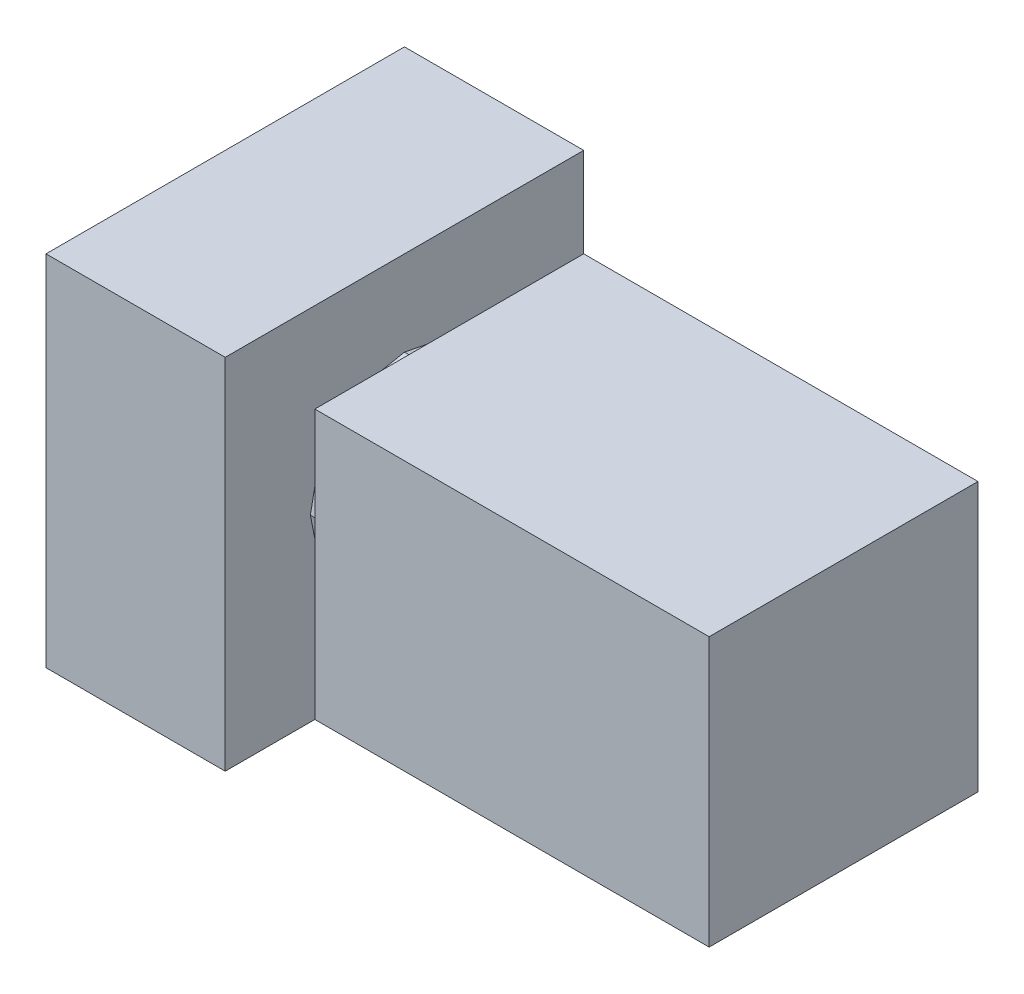
ISO-10303-21;
HEADER;
FILE_DESCRIPTION(('STEP AP214'),'2;1');
FILE_NAME('part.step','',(''),(''),'','','');
FILE_SCHEMA(('AUTOMOTIVE_DESIGN { 1 0 10303 214 1 1 1 1 }'));
ENDSEC;
DATA;
#1=APPLICATION_CONTEXT('core data for automotive mechanical design processes');
#2=APPLICATION_PROTOCOL_DEFINITION('international standard','automotive_design',2000,#1);
#3=PRODUCT_CONTEXT('',#1,'mechanical');
#4=PRODUCT('Part','Part','',(#3));
#5=PRODUCT_RELATED_PRODUCT_CATEGORY('part','',(#4));
#6=PRODUCT_DEFINITION_FORMATION('','',#4);
#7=PRODUCT_DEFINITION_CONTEXT('part definition',#1,'design');
#8=PRODUCT_DEFINITION('design','',#6,#7);
#9=PRODUCT_DEFINITION_SHAPE('','',#8);
#10=(LENGTH_UNIT() NAMED_UNIT(*) SI_UNIT(.MILLI.,.METRE.));
#11=(NAMED_UNIT(*) PLANE_ANGLE_UNIT() SI_UNIT($,.RADIAN.));
#12=(NAMED_UNIT(*) SI_UNIT($,.STERADIAN.) SOLID_ANGLE_UNIT());
#13=UNCERTAINTY_MEASURE_WITH_UNIT(LENGTH_MEASURE(1.E-05),#10,'distance_accuracy_value','');
#14=(GEOMETRIC_REPRESENTATION_CONTEXT(3) GLOBAL_UNCERTAINTY_ASSIGNED_CONTEXT((#13)) GLOBAL_UNIT_ASSIGNED_CONTEXT((#10,
#11,#12)) REPRESENTATION_CONTEXT('',''));
#15=CARTESIAN_POINT('',(0.,0.,0.));
#16=DIRECTION('',(0.,0.,1.));
#17=DIRECTION('',(1.,0.,0.));
#18=AXIS2_PLACEMENT_3D('',#15,#16,#17);
#19=CARTESIAN_POINT('',(-68.5,10.5,235.));
#20=DIRECTION('',(0.,-0.980785280403231,-0.195090322016128));
#21=DIRECTION('',(0.,0.195090322016128,-0.980785280403231));
#22=AXIS2_PLACEMENT_3D('',#19,#20,#21);
#23=PLANE('',#22);
#24=DIRECTION('',(0.,-0.195090322016128,0.980785280403231));
#25=VECTOR('',#24,1.);
#26=CARTESIAN_POINT('',(-69.,10.5,235.));
#27=LINE('',#26,#25);
#28=CARTESIAN_POINT('',(-69.,10.5,235.));
#29=VERTEX_POINT('',#28);
#30=CARTESIAN_POINT('',(-69.,9.70073509136851,239.018176039833));
#31=VERTEX_POINT('',#30);
#32=EDGE_CURVE('E269',#29,#31,#27,.T.);
#33=ORIENTED_EDGE('',*,*,#32,.F.);
#34=DIRECTION('',(-1.,0.,0.));
#35=VECTOR('',#34,1.);
#36=CARTESIAN_POINT('',(-68.5,10.5,235.));
#37=LINE('',#36,#35);
#38=CARTESIAN_POINT('',(-74.,10.5,235.));
#39=VERTEX_POINT('',#38);
#40=EDGE_CURVE('E272',#29,#39,#37,.T.);
#41=ORIENTED_EDGE('',*,*,#40,.T.);
#42=DIRECTION('',(0.,-0.195090322016128,0.980785280403231));
#43=VECTOR('',#42,1.);
#44=CARTESIAN_POINT('',(-74.,5.51232854714624,260.07471766868));
#45=LINE('',#44,#43);
#46=CARTESIAN_POINT('',(-74.,9.70073509136851,239.018176039833));
#47=VERTEX_POINT('',#46);
#48=EDGE_CURVE('E50',#39,#47,#45,.T.);
#49=ORIENTED_EDGE('',*,*,#48,.T.);
#50=DIRECTION('',(-1.,0.,0.));
#51=VECTOR('',#50,1.);
#52=CARTESIAN_POINT('',(-68.5,9.70073509136851,239.018176039833));
#53=LINE('',#52,#51);
#54=EDGE_CURVE('E303',#31,#47,#53,.T.);
#55=ORIENTED_EDGE('',*,*,#54,.F.);
#56=EDGE_LOOP('',(#33,#41,#49,#55));
#57=FACE_BOUND('',#56,.T.);
#58=ADVANCED_FACE('F39',(#57),#23,.F.);
#59=CARTESIAN_POINT('',(-68.5,9.70073509136851,239.018176039833));
#60=DIRECTION('',(0.,-0.831469612302543,-0.555570233019605));
#61=DIRECTION('',(0.,0.555570233019605,-0.831469612302544));
#62=AXIS2_PLACEMENT_3D('',#59,#60,#61);
#63=PLANE('',#62);
#64=DIRECTION('',(0.,-0.555570233019605,0.831469612302544));
#65=VECTOR('',#64,1.);
#66=CARTESIAN_POINT('',(-69.,9.70073509136851,239.018176039833));
#67=LINE('',#66,#65);
#68=CARTESIAN_POINT('',(-69.,7.42462120245875,242.424621202459));
#69=VERTEX_POINT('',#68);
#70=EDGE_CURVE('E53',#31,#69,#67,.T.);
#71=ORIENTED_EDGE('',*,*,#70,.F.);
#72=ORIENTED_EDGE('',*,*,#54,.T.);
#73=DIRECTION('',(0.,-0.555570233019605,0.831469612302544));
#74=VECTOR('',#73,1.);
#75=CARTESIAN_POINT('',(-74.,-6.84928285454845,263.78702826991));
#76=LINE('',#75,#74);
#77=CARTESIAN_POINT('',(-74.,7.42462120245875,242.424621202459));
#78=VERTEX_POINT('',#77);
#79=EDGE_CURVE('E380',#47,#78,#76,.T.);
#80=ORIENTED_EDGE('',*,*,#79,.T.);
#81=DIRECTION('',(-1.,0.,0.));
#82=VECTOR('',#81,1.);
#83=CARTESIAN_POINT('',(-68.5,7.42462120245875,242.424621202459));
#84=LINE('',#83,#82);
#85=EDGE_CURVE('E302',#69,#78,#84,.T.);
#86=ORIENTED_EDGE('',*,*,#85,.F.);
#87=EDGE_LOOP('',(#71,#72,#80,#86));
#88=FACE_BOUND('',#87,.T.);
#89=ADVANCED_FACE('F438',(#88),#63,.F.);
#90=CARTESIAN_POINT('',(-68.5,7.42462120245875,242.424621202459));
#91=DIRECTION('',(0.,-0.555570233019605,-0.831469612302544));
#92=DIRECTION('',(0.,0.831469612302544,-0.555570233019605));
#93=AXIS2_PLACEMENT_3D('',#90,#91,#92);
#94=PLANE('',#93);
#95=DIRECTION('',(0.,-0.831469612302544,0.555570233019605));
#96=VECTOR('',#95,1.);
#97=CARTESIAN_POINT('',(-69.,7.42462120245875,242.424621202459));
#98=LINE('',#97,#96);
#99=CARTESIAN_POINT('',(-69.,4.01817603983344,244.700735091369));
#100=VERTEX_POINT('',#99);
#101=EDGE_CURVE('E65',#69,#100,#98,.T.);
#102=ORIENTED_EDGE('',*,*,#101,.F.);
#103=ORIENTED_EDGE('',*,*,#85,.T.);
#104=DIRECTION('',(0.,-0.831469612302544,0.555570233019605));
#105=VECTOR('',#104,1.);
#106=CARTESIAN_POINT('',(-74.,-17.3442310276176,258.974639148376));
#107=LINE('',#106,#105);
#108=CARTESIAN_POINT('',(-74.,4.01817603983344,244.700735091369));
#109=VERTEX_POINT('',#108);
#110=EDGE_CURVE('E372',#78,#109,#107,.T.);
#111=ORIENTED_EDGE('',*,*,#110,.T.);
#112=DIRECTION('',(-1.,0.,0.));
#113=VECTOR('',#112,1.);
#114=CARTESIAN_POINT('',(-68.5,4.01817603983344,244.700735091369));
#115=LINE('',#114,#113);
#116=EDGE_CURVE('E296',#100,#109,#115,.T.);
#117=ORIENTED_EDGE('',*,*,#116,.F.);
#118=EDGE_LOOP('',(#102,#103,#111,#117));
#119=FACE_BOUND('',#118,.T.);
#120=ADVANCED_FACE('F437',(#119),#94,.F.);
#121=CARTESIAN_POINT('',(-68.5,4.01817603983344,244.700735091369));
#122=DIRECTION('',(0.,-0.19509032201613,-0.98078528040323));
#123=DIRECTION('',(0.,0.98078528040323,-0.19509032201613));
#124=AXIS2_PLACEMENT_3D('',#121,#122,#123);
#125=PLANE('',#124);
#126=DIRECTION('',(0.,-0.98078528040323,0.19509032201613));
#127=VECTOR('',#126,1.);
#128=CARTESIAN_POINT('',(-69.,4.01817603983344,244.700735091369));
#129=LINE('',#128,#127);
#130=CARTESIAN_POINT('',(-69.,0.,245.5));
#131=VERTEX_POINT('',#130);
#132=EDGE_CURVE('E264',#100,#131,#129,.T.);
#133=ORIENTED_EDGE('',*,*,#132,.F.);
#134=ORIENTED_EDGE('',*,*,#116,.T.);
#135=DIRECTION('',(0.,-0.98078528040323,0.19509032201613));
#136=VECTOR('',#135,1.);
#137=CARTESIAN_POINT('',(-74.,-21.0565416288471,249.688406544222));
#138=LINE('',#137,#136);
#139=CARTESIAN_POINT('',(-74.,0.,245.5));
#140=VERTEX_POINT('',#139);
#141=EDGE_CURVE('E371',#109,#140,#138,.T.);
#142=ORIENTED_EDGE('',*,*,#141,.T.);
#143=DIRECTION('',(-1.,0.,0.));
#144=VECTOR('',#143,1.);
#145=CARTESIAN_POINT('',(-68.5,0.,245.5));
#146=LINE('',#145,#144);
#147=EDGE_CURVE('E300',#131,#140,#146,.T.);
#148=ORIENTED_EDGE('',*,*,#147,.F.);
#149=EDGE_LOOP('',(#133,#134,#142,#148));
#150=FACE_BOUND('',#149,.T.);
#151=ADVANCED_FACE('F440',(#150),#125,.F.);
#152=CARTESIAN_POINT('',(-68.5,0.,245.5));
#153=DIRECTION('',(0.,0.19509032201613,-0.98078528040323));
#154=DIRECTION('',(0.,0.98078528040323,0.19509032201613));
#155=AXIS2_PLACEMENT_3D('',#152,#153,#154);
#156=PLANE('',#155);
#157=DIRECTION('',(0.,-0.98078528040323,-0.19509032201613));
#158=VECTOR('',#157,1.);
#159=CARTESIAN_POINT('',(-69.,0.,245.5));
#160=LINE('',#159,#158);
#161=CARTESIAN_POINT('',(-69.,-4.01817603983344,244.700735091369));
#162=VERTEX_POINT('',#161);
#163=EDGE_CURVE('E265',#131,#162,#160,.T.);
#164=ORIENTED_EDGE('',*,*,#163,.F.);
#165=ORIENTED_EDGE('',*,*,#147,.T.);
#166=DIRECTION('',(0.,-0.98078528040323,-0.19509032201613));
#167=VECTOR('',#166,1.);
#168=CARTESIAN_POINT('',(-74.,-17.4210490213787,242.03473789692));
#169=LINE('',#168,#167);
#170=CARTESIAN_POINT('',(-74.,-4.01817603983344,244.700735091369));
#171=VERTEX_POINT('',#170);
#172=EDGE_CURVE('E366',#140,#171,#169,.T.);
#173=ORIENTED_EDGE('',*,*,#172,.T.);
#174=DIRECTION('',(-1.,0.,0.));
#175=VECTOR('',#174,1.);
#176=CARTESIAN_POINT('',(-68.5,-4.01817603983344,244.700735091369));
#177=LINE('',#176,#175);
#178=EDGE_CURVE('E293',#162,#171,#177,.T.);
#179=ORIENTED_EDGE('',*,*,#178,.F.);
#180=EDGE_LOOP('',(#164,#165,#173,#179));
#181=FACE_BOUND('',#180,.T.);
#182=ADVANCED_FACE('F435',(#181),#156,.F.);
#183=CARTESIAN_POINT('',(-68.5,-4.01817603983344,244.700735091369));
#184=DIRECTION('',(0.,0.555570233019605,-0.831469612302544));
#185=DIRECTION('',(0.,0.831469612302544,0.555570233019605));
#186=AXIS2_PLACEMENT_3D('',#183,#184,#185);
#187=PLANE('',#186);
#188=DIRECTION('',(0.,-0.831469612302544,-0.555570233019605));
#189=VECTOR('',#188,1.);
#190=CARTESIAN_POINT('',(-69.,-4.01817603983344,244.700735091369));
#191=LINE('',#190,#189);
#192=CARTESIAN_POINT('',(-69.,-7.42462120245875,242.424621202459));
#193=VERTEX_POINT('',#192);
#194=EDGE_CURVE('E259',#162,#193,#191,.T.);
#195=ORIENTED_EDGE('',*,*,#194,.F.);
#196=ORIENTED_EDGE('',*,*,#178,.T.);
#197=DIRECTION('',(0.,-0.831469612302544,-0.555570233019605));
#198=VECTOR('',#197,1.);
#199=CARTESIAN_POINT('',(-74.,-10.3094376196841,240.49704849815));
#200=LINE('',#199,#198);
#201=CARTESIAN_POINT('',(-74.,-7.42462120245875,242.424621202459));
#202=VERTEX_POINT('',#201);
#203=EDGE_CURVE('E364',#171,#202,#200,.T.);
#204=ORIENTED_EDGE('',*,*,#203,.T.);
#205=DIRECTION('',(-1.,0.,0.));
#206=VECTOR('',#205,1.);
#207=CARTESIAN_POINT('',(-68.5,-7.42462120245875,242.424621202459));
#208=LINE('',#207,#206);
#209=EDGE_CURVE('E291',#193,#202,#208,.T.);
#210=ORIENTED_EDGE('',*,*,#209,.F.);
#211=EDGE_LOOP('',(#195,#196,#204,#210));
#212=FACE_BOUND('',#211,.T.);
#213=ADVANCED_FACE('F427',(#212),#187,.F.);
#214=CARTESIAN_POINT('',(-68.5,-7.42462120245875,242.424621202459));
#215=DIRECTION('',(0.,0.831469612302543,-0.555570233019605));
#216=DIRECTION('',(0.,0.555570233019605,0.831469612302543));
#217=AXIS2_PLACEMENT_3D('',#214,#215,#216);
#218=PLANE('',#217);
#219=DIRECTION('',(0.,-0.555570233019605,-0.831469612302543));
#220=VECTOR('',#219,1.);
#221=CARTESIAN_POINT('',(-69.,-7.42462120245875,242.424621202459));
#222=LINE('',#221,#220);
#223=CARTESIAN_POINT('',(-69.,-9.70073509136851,239.018176039833));
#224=VERTEX_POINT('',#223);
#225=EDGE_CURVE('E258',#193,#224,#222,.T.);
#226=ORIENTED_EDGE('',*,*,#225,.F.);
#227=ORIENTED_EDGE('',*,*,#209,.T.);
#228=DIRECTION('',(0.,-0.555570233019605,-0.831469612302543));
#229=VECTOR('',#228,1.);
#230=CARTESIAN_POINT('',(-74.,-5.49704849814987,245.309437619684));
#231=LINE('',#230,#229);
#232=CARTESIAN_POINT('',(-74.,-9.70073509136851,239.018176039833));
#233=VERTEX_POINT('',#232);
#234=EDGE_CURVE('E362',#202,#233,#231,.T.);
#235=ORIENTED_EDGE('',*,*,#234,.T.);
#236=DIRECTION('',(-1.,0.,0.));
#237=VECTOR('',#236,1.);
#238=CARTESIAN_POINT('',(-68.5,-9.70073509136851,239.018176039833));
#239=LINE('',#238,#237);
#240=EDGE_CURVE('E292',#224,#233,#239,.T.);
#241=ORIENTED_EDGE('',*,*,#240,.F.);
#242=EDGE_LOOP('',(#226,#227,#235,#241));
#243=FACE_BOUND('',#242,.T.);
#244=ADVANCED_FACE('F422',(#243),#218,.F.);
#245=CARTESIAN_POINT('',(-68.5,-9.70073509136851,239.018176039833));
#246=DIRECTION('',(0.,0.980785280403231,-0.195090322016128));
#247=DIRECTION('',(0.,0.195090322016128,0.980785280403231));
#248=AXIS2_PLACEMENT_3D('',#245,#246,#247);
#249=PLANE('',#248);
#250=DIRECTION('',(0.,-0.195090322016128,-0.980785280403231));
#251=VECTOR('',#250,1.);
#252=CARTESIAN_POINT('',(-69.,-9.70073509136851,239.018176039833));
#253=LINE('',#252,#251);
#254=CARTESIAN_POINT('',(-69.,-10.5,235.));
#255=VERTEX_POINT('',#254);
#256=EDGE_CURVE('E251',#224,#255,#253,.T.);
#257=ORIENTED_EDGE('',*,*,#256,.F.);
#258=ORIENTED_EDGE('',*,*,#240,.T.);
#259=DIRECTION('',(0.,-0.195090322016128,-0.980785280403231));
#260=VECTOR('',#259,1.);
#261=CARTESIAN_POINT('',(-74.,-7.0347378969205,252.421049021379));
#262=LINE('',#261,#260);
#263=CARTESIAN_POINT('',(-74.,-10.5,235.));
#264=VERTEX_POINT('',#263);
#265=EDGE_CURVE('E359',#233,#264,#262,.T.);
#266=ORIENTED_EDGE('',*,*,#265,.T.);
#267=DIRECTION('',(-1.,0.,0.));
#268=VECTOR('',#267,1.);
#269=CARTESIAN_POINT('',(-68.5,-10.5,235.));
#270=LINE('',#269,#268);
#271=EDGE_CURVE('E289',#255,#264,#270,.T.);
#272=ORIENTED_EDGE('',*,*,#271,.F.);
#273=EDGE_LOOP('',(#257,#258,#266,#272));
#274=FACE_BOUND('',#273,.T.);
#275=ADVANCED_FACE('F425',(#274),#249,.F.);
#276=CARTESIAN_POINT('',(-68.5,-10.5,235.));
#277=DIRECTION('',(0.,0.980785280403231,0.195090322016128));
#278=DIRECTION('',(0.,-0.195090322016128,0.980785280403231));
#279=AXIS2_PLACEMENT_3D('',#276,#277,#278);
#280=PLANE('',#279);
#281=DIRECTION('',(0.,0.195090322016128,-0.980785280403231));
#282=VECTOR('',#281,1.);
#283=CARTESIAN_POINT('',(-69.,-10.5,235.));
#284=LINE('',#283,#282);
#285=CARTESIAN_POINT('',(-69.,-9.70073509136851,230.981823960167));
#286=VERTEX_POINT('',#285);
#287=EDGE_CURVE('E246',#255,#286,#284,.T.);
#288=ORIENTED_EDGE('',*,*,#287,.F.);
#289=ORIENTED_EDGE('',*,*,#271,.T.);
#290=DIRECTION('',(0.,0.195090322016128,-0.980785280403231));
#291=VECTOR('',#290,1.);
#292=CARTESIAN_POINT('',(-74.,-14.6884065442223,256.056541628847));
#293=LINE('',#292,#291);
#294=CARTESIAN_POINT('',(-74.,-9.70073509136852,230.981823960167));
#295=VERTEX_POINT('',#294);
#296=EDGE_CURVE('E357',#264,#295,#293,.T.);
#297=ORIENTED_EDGE('',*,*,#296,.T.);
#298=DIRECTION('',(-1.,0.,0.));
#299=VECTOR('',#298,1.);
#300=CARTESIAN_POINT('',(-68.5,-9.70073509136851,230.981823960167));
#301=LINE('',#300,#299);
#302=EDGE_CURVE('E290',#286,#295,#301,.T.);
#303=ORIENTED_EDGE('',*,*,#302,.F.);
#304=EDGE_LOOP('',(#288,#289,#297,#303));
#305=FACE_BOUND('',#304,.T.);
#306=ADVANCED_FACE('F418',(#305),#280,.F.);
#307=CARTESIAN_POINT('',(-68.5,-9.70073509136851,230.981823960167));
#308=DIRECTION('',(0.,0.831469612302544,0.555570233019605));
#309=DIRECTION('',(0.,-0.555570233019605,0.831469612302544));
#310=AXIS2_PLACEMENT_3D('',#307,#308,#309);
#311=PLANE('',#310);
#312=DIRECTION('',(0.,0.555570233019605,-0.831469612302544));
#313=VECTOR('',#312,1.);
#314=CARTESIAN_POINT('',(-69.,-9.70073509136851,230.981823960167));
#315=LINE('',#314,#313);
#316=CARTESIAN_POINT('',(-69.,-7.42462120245875,227.575378797541));
#317=VERTEX_POINT('',#316);
#318=EDGE_CURVE('E250',#286,#317,#315,.T.);
#319=ORIENTED_EDGE('',*,*,#318,.F.);
#320=ORIENTED_EDGE('',*,*,#302,.T.);
#321=DIRECTION('',(0.,0.555570233019605,-0.831469612302544));
#322=VECTOR('',#321,1.);
#323=CARTESIAN_POINT('',(-74.,-23.9746391483757,252.344231027618));
#324=LINE('',#323,#322);
#325=CARTESIAN_POINT('',(-74.,-7.42462120245875,227.575378797541));
#326=VERTEX_POINT('',#325);
#327=EDGE_CURVE('E354',#295,#326,#324,.T.);
#328=ORIENTED_EDGE('',*,*,#327,.T.);
#329=DIRECTION('',(-1.,0.,0.));
#330=VECTOR('',#329,1.);
#331=CARTESIAN_POINT('',(-68.5,-7.42462120245875,227.575378797541));
#332=LINE('',#331,#330);
#333=EDGE_CURVE('E283',#317,#326,#332,.T.);
#334=ORIENTED_EDGE('',*,*,#333,.F.);
#335=EDGE_LOOP('',(#319,#320,#328,#334));
#336=FACE_BOUND('',#335,.T.);
#337=ADVANCED_FACE('F413',(#336),#311,.F.);
#338=CARTESIAN_POINT('',(-68.5,-7.42462120245875,227.575378797541));
#339=DIRECTION('',(0.,0.555570233019604,0.831469612302544));
#340=DIRECTION('',(0.,-0.831469612302544,0.555570233019604));
#341=AXIS2_PLACEMENT_3D('',#338,#339,#340);
#342=PLANE('',#341);
#343=DIRECTION('',(0.,0.831469612302544,-0.555570233019604));
#344=VECTOR('',#343,1.);
#345=CARTESIAN_POINT('',(-69.,-7.42462120245875,227.575378797541));
#346=LINE('',#345,#344);
#347=CARTESIAN_POINT('',(-69.,-4.01817603983344,225.299264908631));
#348=VERTEX_POINT('',#347);
#349=EDGE_CURVE('E241',#317,#348,#346,.T.);
#350=ORIENTED_EDGE('',*,*,#349,.F.);
#351=ORIENTED_EDGE('',*,*,#333,.T.);
#352=DIRECTION('',(0.,0.831469612302544,-0.555570233019604));
#353=VECTOR('',#352,1.);
#354=CARTESIAN_POINT('',(-74.,-28.7870282699099,241.849282854548));
#355=LINE('',#354,#353);
#356=CARTESIAN_POINT('',(-74.,-4.01817603983344,225.299264908631));
#357=VERTEX_POINT('',#356);
#358=EDGE_CURVE('E348',#326,#357,#355,.T.);
#359=ORIENTED_EDGE('',*,*,#358,.T.);
#360=DIRECTION('',(-1.,0.,0.));
#361=VECTOR('',#360,1.);
#362=CARTESIAN_POINT('',(-68.5,-4.01817603983344,225.299264908631));
#363=LINE('',#362,#361);
#364=EDGE_CURVE('E284',#348,#357,#363,.T.);
#365=ORIENTED_EDGE('',*,*,#364,.F.);
#366=EDGE_LOOP('',(#350,#351,#359,#365));
#367=FACE_BOUND('',#366,.T.);
#368=ADVANCED_FACE('F406',(#367),#342,.F.);
#369=CARTESIAN_POINT('',(-68.5,-4.01817603983344,225.299264908631));
#370=DIRECTION('',(0.,0.19509032201613,0.98078528040323));
#371=DIRECTION('',(0.,-0.98078528040323,0.19509032201613));
#372=AXIS2_PLACEMENT_3D('',#369,#370,#371);
#373=PLANE('',#372);
#374=DIRECTION('',(0.,0.98078528040323,-0.19509032201613));
#375=VECTOR('',#374,1.);
#376=CARTESIAN_POINT('',(-69.,-4.01817603983344,225.299264908631));
#377=LINE('',#376,#375);
#378=CARTESIAN_POINT('',(-69.,0.,224.5));
#379=VERTEX_POINT('',#378);
#380=EDGE_CURVE('E242',#348,#379,#377,.T.);
#381=ORIENTED_EDGE('',*,*,#380,.F.);
#382=ORIENTED_EDGE('',*,*,#364,.T.);
#383=DIRECTION('',(0.,0.98078528040323,-0.19509032201613));
#384=VECTOR('',#383,1.);
#385=CARTESIAN_POINT('',(-74.,-25.0747176686805,229.487671452854));
#386=LINE('',#385,#384);
#387=CARTESIAN_POINT('',(-74.,0.,224.5));
#388=VERTEX_POINT('',#387);
#389=EDGE_CURVE('E350',#357,#388,#386,.T.);
#390=ORIENTED_EDGE('',*,*,#389,.T.);
#391=DIRECTION('',(-1.,0.,0.));
#392=VECTOR('',#391,1.);
#393=CARTESIAN_POINT('',(-68.5,0.,224.5));
#394=LINE('',#393,#392);
#395=EDGE_CURVE('E282',#379,#388,#394,.T.);
#396=ORIENTED_EDGE('',*,*,#395,.F.);
#397=EDGE_LOOP('',(#381,#382,#390,#396));
#398=FACE_BOUND('',#397,.T.);
#399=ADVANCED_FACE('F407',(#398),#373,.F.);
#400=CARTESIAN_POINT('',(-68.5,0.,224.5));
#401=DIRECTION('',(0.,-0.19509032201613,0.98078528040323));
#402=DIRECTION('',(0.,-0.98078528040323,-0.19509032201613));
#403=AXIS2_PLACEMENT_3D('',#400,#401,#402);
#404=PLANE('',#403);
#405=DIRECTION('',(0.,0.98078528040323,0.19509032201613));
#406=VECTOR('',#405,1.);
#407=CARTESIAN_POINT('',(-69.,0.,224.5));
#408=LINE('',#407,#406);
#409=CARTESIAN_POINT('',(-69.,4.01817603983345,225.299264908631));
#410=VERTEX_POINT('',#409);
#411=EDGE_CURVE('E236',#379,#410,#408,.T.);
#412=ORIENTED_EDGE('',*,*,#411,.F.);
#413=ORIENTED_EDGE('',*,*,#395,.T.);
#414=DIRECTION('',(0.,0.98078528040323,0.19509032201613));
#415=VECTOR('',#414,1.);
#416=CARTESIAN_POINT('',(-74.,-13.4028729815452,221.834002805552));
#417=LINE('',#416,#415);
#418=CARTESIAN_POINT('',(-74.,4.01817603983345,225.299264908631));
#419=VERTEX_POINT('',#418);
#420=EDGE_CURVE('E344',#388,#419,#417,.T.);
#421=ORIENTED_EDGE('',*,*,#420,.T.);
#422=DIRECTION('',(-1.,0.,0.));
#423=VECTOR('',#422,1.);
#424=CARTESIAN_POINT('',(-68.5,4.01817603983345,225.299264908631));
#425=LINE('',#424,#423);
#426=EDGE_CURVE('E276',#410,#419,#425,.T.);
#427=ORIENTED_EDGE('',*,*,#426,.F.);
#428=EDGE_LOOP('',(#412,#413,#421,#427));
#429=FACE_BOUND('',#428,.T.);
#430=ADVANCED_FACE('F396',(#429),#404,.F.);
#431=CARTESIAN_POINT('',(-68.5,4.01817603983345,225.299264908631));
#432=DIRECTION('',(0.,-0.5555702330196,0.831469612302546));
#433=DIRECTION('',(0.,-0.831469612302547,-0.5555702330196));
#434=AXIS2_PLACEMENT_3D('',#431,#432,#433);
#435=PLANE('',#434);
#436=DIRECTION('',(0.,0.831469612302547,0.5555702330196));
#437=VECTOR('',#436,1.);
#438=CARTESIAN_POINT('',(-69.,4.01817603983345,225.299264908631));
#439=LINE('',#438,#437);
#440=CARTESIAN_POINT('',(-69.,7.42462120245875,227.575378797541));
#441=VERTEX_POINT('',#440);
#442=EDGE_CURVE('E228',#410,#441,#439,.T.);
#443=ORIENTED_EDGE('',*,*,#442,.F.);
#444=ORIENTED_EDGE('',*,*,#426,.T.);
#445=DIRECTION('',(0.,0.831469612302547,0.5555702330196));
#446=VECTOR('',#445,1.);
#447=CARTESIAN_POINT('',(-74.,1.13335962260799,223.371692204323));
#448=LINE('',#447,#446);
#449=CARTESIAN_POINT('',(-74.,7.42462120245874,227.575378797541));
#450=VERTEX_POINT('',#449);
#451=EDGE_CURVE('E342',#419,#450,#448,.T.);
#452=ORIENTED_EDGE('',*,*,#451,.T.);
#453=DIRECTION('',(-1.,0.,0.));
#454=VECTOR('',#453,1.);
#455=CARTESIAN_POINT('',(-68.5,7.42462120245875,227.575378797541));
#456=LINE('',#455,#454);
#457=EDGE_CURVE('E280',#441,#450,#456,.T.);
#458=ORIENTED_EDGE('',*,*,#457,.F.);
#459=EDGE_LOOP('',(#443,#444,#452,#458));
#460=FACE_BOUND('',#459,.T.);
#461=ADVANCED_FACE('F400',(#460),#435,.F.);
#462=CARTESIAN_POINT('',(-68.5,7.42462120245875,227.575378797541));
#463=DIRECTION('',(0.,-0.831469612302545,0.555570233019602));
#464=DIRECTION('',(0.,-0.555570233019602,-0.831469612302545));
#465=AXIS2_PLACEMENT_3D('',#462,#463,#464);
#466=PLANE('',#465);
#467=DIRECTION('',(0.,0.555570233019602,0.831469612302545));
#468=VECTOR('',#467,1.);
#469=CARTESIAN_POINT('',(-69.,7.42462120245875,227.575378797541));
#470=LINE('',#469,#468);
#471=CARTESIAN_POINT('',(-69.,9.70073509136851,230.981823960167));
#472=VERTEX_POINT('',#471);
#473=EDGE_CURVE('E230',#441,#472,#470,.T.);
#474=ORIENTED_EDGE('',*,*,#473,.F.);
#475=ORIENTED_EDGE('',*,*,#457,.T.);
#476=DIRECTION('',(0.,0.555570233019602,0.831469612302545));
#477=VECTOR('',#476,1.);
#478=CARTESIAN_POINT('',(-74.,11.6283077956774,233.866640377392));
#479=LINE('',#478,#477);
#480=CARTESIAN_POINT('',(-74.,9.70073509136851,230.981823960167));
#481=VERTEX_POINT('',#480);
#482=EDGE_CURVE('E339',#450,#481,#479,.T.);
#483=ORIENTED_EDGE('',*,*,#482,.T.);
#484=DIRECTION('',(-1.,0.,0.));
#485=VECTOR('',#484,1.);
#486=CARTESIAN_POINT('',(-68.5,9.70073509136851,230.981823960167));
#487=LINE('',#486,#485);
#488=EDGE_CURVE('E274',#472,#481,#487,.T.);
#489=ORIENTED_EDGE('',*,*,#488,.F.);
#490=EDGE_LOOP('',(#474,#475,#483,#489));
#491=FACE_BOUND('',#490,.T.);
#492=ADVANCED_FACE('F394',(#491),#466,.F.);
#493=CARTESIAN_POINT('',(-68.5,9.70073509136851,230.981823960167));
#494=DIRECTION('',(0.,-0.980785280403231,0.195090322016128));
#495=DIRECTION('',(0.,-0.195090322016128,-0.980785280403231));
#496=AXIS2_PLACEMENT_3D('',#493,#494,#495);
#497=PLANE('',#496);
#498=DIRECTION('',(0.,0.195090322016128,0.980785280403231));
#499=VECTOR('',#498,1.);
#500=CARTESIAN_POINT('',(-69.,9.70073509136851,230.981823960167));
#501=LINE('',#500,#499);
#502=EDGE_CURVE('E11',#472,#29,#501,.T.);
#503=ORIENTED_EDGE('',*,*,#502,.F.);
#504=ORIENTED_EDGE('',*,*,#488,.T.);
#505=DIRECTION('',(0.,0.195090322016128,0.980785280403231));
#506=VECTOR('',#505,1.);
#507=CARTESIAN_POINT('',(-74.,13.165997194448,248.402872981545));
#508=LINE('',#507,#506);
#509=EDGE_CURVE('E333',#481,#39,#508,.T.);
#510=ORIENTED_EDGE('',*,*,#509,.T.);
#511=ORIENTED_EDGE('',*,*,#40,.F.);
#512=EDGE_LOOP('',(#503,#504,#510,#511));
#513=FACE_BOUND('',#512,.T.);
#514=ADVANCED_FACE('F388',(#513),#497,.F.);
#515=CARTESIAN_POINT('',(-74.,-20.,255.));
#516=DIRECTION('',(-1.,0.,0.));
#517=DIRECTION('',(0.,0.,1.));
#518=AXIS2_PLACEMENT_3D('',#515,#516,#517);
#519=PLANE('',#518);
#520=DIRECTION('',(0.,1.,0.));
#521=VECTOR('',#520,1.);
#522=CARTESIAN_POINT('',(-74.,-20.,215.));
#523=LINE('',#522,#521);
#524=CARTESIAN_POINT('',(-74.,-20.,215.));
#525=VERTEX_POINT('',#524);
#526=CARTESIAN_POINT('',(-74.,20.,215.));
#527=VERTEX_POINT('',#526);
#528=EDGE_CURVE('E321',#525,#527,#523,.T.);
#529=ORIENTED_EDGE('',*,*,#528,.T.);
#530=DIRECTION('',(0.,0.,-1.));
#531=VECTOR('',#530,1.);
#532=CARTESIAN_POINT('',(-74.,20.,255.));
#533=LINE('',#532,#531);
#534=CARTESIAN_POINT('',(-74.,20.,255.));
#535=VERTEX_POINT('',#534);
#536=EDGE_CURVE('E326',#535,#527,#533,.T.);
#537=ORIENTED_EDGE('',*,*,#536,.F.);
#538=DIRECTION('',(0.,1.,0.));
#539=VECTOR('',#538,1.);
#540=CARTESIAN_POINT('',(-74.,-20.,255.));
#541=LINE('',#540,#539);
#542=CARTESIAN_POINT('',(-74.,-20.,255.));
#543=VERTEX_POINT('',#542);
#544=EDGE_CURVE('E315',#543,#535,#541,.T.);
#545=ORIENTED_EDGE('',*,*,#544,.F.);
#546=DIRECTION('',(0.,0.,-1.));
#547=VECTOR('',#546,1.);
#548=CARTESIAN_POINT('',(-74.,-20.,255.));
#549=LINE('',#548,#547);
#550=EDGE_CURVE('E328',#543,#525,#549,.T.);
#551=ORIENTED_EDGE('',*,*,#550,.T.);
#552=EDGE_LOOP('',(#529,#537,#545,#551));
#553=FACE_BOUND('',#552,.T.);
#554=ORIENTED_EDGE('',*,*,#48,.F.);
#555=ORIENTED_EDGE('',*,*,#509,.F.);
#556=ORIENTED_EDGE('',*,*,#482,.F.);
#557=ORIENTED_EDGE('',*,*,#451,.F.);
#558=ORIENTED_EDGE('',*,*,#420,.F.);
#559=ORIENTED_EDGE('',*,*,#389,.F.);
#560=ORIENTED_EDGE('',*,*,#358,.F.);
#561=ORIENTED_EDGE('',*,*,#327,.F.);
#562=ORIENTED_EDGE('',*,*,#296,.F.);
#563=ORIENTED_EDGE('',*,*,#265,.F.);
#564=ORIENTED_EDGE('',*,*,#234,.F.);
#565=ORIENTED_EDGE('',*,*,#203,.F.);
#566=ORIENTED_EDGE('',*,*,#172,.F.);
#567=ORIENTED_EDGE('',*,*,#141,.F.);
#568=ORIENTED_EDGE('',*,*,#110,.F.);
#569=ORIENTED_EDGE('',*,*,#79,.F.);
#570=EDGE_LOOP('',(#554,#555,#556,#557,#558,#559,#560,#561,#562,#563,#564,#565,#566,#567,#568,#569));
#571=FACE_BOUND('',#570,.T.);
#572=ADVANCED_FACE('F387',(#553,#571),#519,.F.);
#573=CARTESIAN_POINT('',(-94.,20.,255.));
#574=DIRECTION('',(1.,0.,0.));
#575=DIRECTION('',(0.,0.,-1.));
#576=AXIS2_PLACEMENT_3D('',#573,#574,#575);
#577=PLANE('',#576);
#578=DIRECTION('',(0.,-1.,0.));
#579=VECTOR('',#578,1.);
#580=CARTESIAN_POINT('',(-94.,20.,215.));
#581=LINE('',#580,#579);
#582=CARTESIAN_POINT('',(-94.,20.,215.));
#583=VERTEX_POINT('',#582);
#584=CARTESIAN_POINT('',(-94.,-20.,215.));
#585=VERTEX_POINT('',#584);
#586=EDGE_CURVE('E301',#583,#585,#581,.T.);
#587=ORIENTED_EDGE('',*,*,#586,.T.);
#588=DIRECTION('',(0.,0.,-1.));
#589=VECTOR('',#588,1.);
#590=CARTESIAN_POINT('',(-94.,-20.,255.));
#591=LINE('',#590,#589);
#592=CARTESIAN_POINT('',(-94.,-20.,255.));
#593=VERTEX_POINT('',#592);
#594=EDGE_CURVE('E335',#593,#585,#591,.T.);
#595=ORIENTED_EDGE('',*,*,#594,.F.);
#596=DIRECTION('',(0.,-1.,0.));
#597=VECTOR('',#596,1.);
#598=CARTESIAN_POINT('',(-94.,20.,255.));
#599=LINE('',#598,#597);
#600=CARTESIAN_POINT('',(-94.,20.,255.));
#601=VERTEX_POINT('',#600);
#602=EDGE_CURVE('E308',#601,#593,#599,.T.);
#603=ORIENTED_EDGE('',*,*,#602,.F.);
#604=DIRECTION('',(0.,0.,-1.));
#605=VECTOR('',#604,1.);
#606=CARTESIAN_POINT('',(-94.,20.,255.));
#607=LINE('',#606,#605);
#608=EDGE_CURVE('E316',#601,#583,#607,.T.);
#609=ORIENTED_EDGE('',*,*,#608,.T.);
#610=EDGE_LOOP('',(#587,#595,#603,#609));
#611=FACE_BOUND('',#610,.T.);
#612=ADVANCED_FACE('F41',(#611),#577,.F.);
#613=CARTESIAN_POINT('',(-94.,-20.,255.));
#614=DIRECTION('',(0.,1.,0.));
#615=DIRECTION('',(0.,0.,1.));
#616=AXIS2_PLACEMENT_3D('',#613,#614,#615);
#617=PLANE('',#616);
#618=DIRECTION('',(1.,0.,0.));
#619=VECTOR('',#618,1.);
#620=CARTESIAN_POINT('',(-94.,-20.,215.));
#621=LINE('',#620,#619);
#622=EDGE_CURVE('E317',#585,#525,#621,.T.);
#623=ORIENTED_EDGE('',*,*,#622,.T.);
#624=ORIENTED_EDGE('',*,*,#550,.F.);
#625=DIRECTION('',(1.,0.,0.));
#626=VECTOR('',#625,1.);
#627=CARTESIAN_POINT('',(-94.,-20.,255.));
#628=LINE('',#627,#626);
#629=EDGE_CURVE('E310',#593,#543,#628,.T.);
#630=ORIENTED_EDGE('',*,*,#629,.F.);
#631=ORIENTED_EDGE('',*,*,#594,.T.);
#632=EDGE_LOOP('',(#623,#624,#630,#631));
#633=FACE_BOUND('',#632,.T.);
#634=ADVANCED_FACE('F462',(#633),#617,.F.);
#635=CARTESIAN_POINT('',(-74.,20.,255.));
#636=DIRECTION('',(0.,-1.,0.));
#637=DIRECTION('',(0.,0.,-1.));
#638=AXIS2_PLACEMENT_3D('',#635,#636,#637);
#639=PLANE('',#638);
#640=DIRECTION('',(-1.,0.,0.));
#641=VECTOR('',#640,1.);
#642=CARTESIAN_POINT('',(-74.,20.,215.));
#643=LINE('',#642,#641);
#644=EDGE_CURVE('E309',#527,#583,#643,.T.);
#645=ORIENTED_EDGE('',*,*,#644,.T.);
#646=ORIENTED_EDGE('',*,*,#608,.F.);
#647=DIRECTION('',(-1.,0.,0.));
#648=VECTOR('',#647,1.);
#649=CARTESIAN_POINT('',(-74.,20.,255.));
#650=LINE('',#649,#648);
#651=EDGE_CURVE('E314',#535,#601,#650,.T.);
#652=ORIENTED_EDGE('',*,*,#651,.F.);
#653=ORIENTED_EDGE('',*,*,#536,.T.);
#654=EDGE_LOOP('',(#645,#646,#652,#653));
#655=FACE_BOUND('',#654,.T.);
#656=ADVANCED_FACE('F454',(#655),#639,.F.);
#657=CARTESIAN_POINT('',(0.,0.,255.));
#658=DIRECTION('',(0.,0.,1.));
#659=DIRECTION('',(1.,0.,0.));
#660=AXIS2_PLACEMENT_3D('',#657,#658,#659);
#661=PLANE('',#660);
#662=ORIENTED_EDGE('',*,*,#602,.T.);
#663=ORIENTED_EDGE('',*,*,#629,.T.);
#664=ORIENTED_EDGE('',*,*,#544,.T.);
#665=ORIENTED_EDGE('',*,*,#651,.T.);
#666=EDGE_LOOP('',(#662,#663,#664,#665));
#667=FACE_BOUND('',#666,.T.);
#668=ADVANCED_FACE('F448',(#667),#661,.T.);
#669=CARTESIAN_POINT('',(0.,0.,215.));
#670=DIRECTION('',(0.,0.,1.));
#671=DIRECTION('',(1.,0.,0.));
#672=AXIS2_PLACEMENT_3D('',#669,#670,#671);
#673=PLANE('',#672);
#674=ORIENTED_EDGE('',*,*,#586,.F.);
#675=ORIENTED_EDGE('',*,*,#644,.F.);
#676=ORIENTED_EDGE('',*,*,#528,.F.);
#677=ORIENTED_EDGE('',*,*,#622,.F.);
#678=EDGE_LOOP('',(#674,#675,#676,#677));
#679=FACE_BOUND('',#678,.T.);
#680=ADVANCED_FACE('F453',(#679),#673,.F.);
#681=CARTESIAN_POINT('',(-69.,15.,250.));
#682=DIRECTION('',(1.,0.,0.));
#683=DIRECTION('',(0.,0.,-1.));
#684=AXIS2_PLACEMENT_3D('',#681,#682,#683);
#685=PLANE('',#684);
#686=DIRECTION('',(0.,-1.,0.));
#687=VECTOR('',#686,1.);
#688=CARTESIAN_POINT('',(-69.,15.,220.));
#689=LINE('',#688,#687);
#690=CARTESIAN_POINT('',(-69.,15.,220.));
#691=VERTEX_POINT('',#690);
#692=CARTESIAN_POINT('',(-69.,-15.,220.));
#693=VERTEX_POINT('',#692);
#694=EDGE_CURVE('E227',#691,#693,#689,.T.);
#695=ORIENTED_EDGE('',*,*,#694,.T.);
#696=DIRECTION('',(0.,0.,-1.));
#697=VECTOR('',#696,1.);
#698=CARTESIAN_POINT('',(-69.,-15.,250.));
#699=LINE('',#698,#697);
#700=CARTESIAN_POINT('',(-69.,-15.,250.));
#701=VERTEX_POINT('',#700);
#702=EDGE_CURVE('E202',#701,#693,#699,.T.);
#703=ORIENTED_EDGE('',*,*,#702,.F.);
#704=DIRECTION('',(0.,-1.,0.));
#705=VECTOR('',#704,1.);
#706=CARTESIAN_POINT('',(-69.,15.,250.));
#707=LINE('',#706,#705);
#708=CARTESIAN_POINT('',(-69.,15.,250.));
#709=VERTEX_POINT('',#708);
#710=EDGE_CURVE('E215',#709,#701,#707,.T.);
#711=ORIENTED_EDGE('',*,*,#710,.F.);
#712=DIRECTION('',(0.,0.,-1.));
#713=VECTOR('',#712,1.);
#714=CARTESIAN_POINT('',(-69.,15.,250.));
#715=LINE('',#714,#713);
#716=EDGE_CURVE('E684',#709,#691,#715,.T.);
#717=ORIENTED_EDGE('',*,*,#716,.T.);
#718=EDGE_LOOP('',(#695,#703,#711,#717));
#719=FACE_BOUND('',#718,.T.);
#720=ORIENTED_EDGE('',*,*,#502,.T.);
#721=ORIENTED_EDGE('',*,*,#32,.T.);
#722=ORIENTED_EDGE('',*,*,#70,.T.);
#723=ORIENTED_EDGE('',*,*,#101,.T.);
#724=ORIENTED_EDGE('',*,*,#132,.T.);
#725=ORIENTED_EDGE('',*,*,#163,.T.);
#726=ORIENTED_EDGE('',*,*,#194,.T.);
#727=ORIENTED_EDGE('',*,*,#225,.T.);
#728=ORIENTED_EDGE('',*,*,#256,.T.);
#729=ORIENTED_EDGE('',*,*,#287,.T.);
#730=ORIENTED_EDGE('',*,*,#318,.T.);
#731=ORIENTED_EDGE('',*,*,#349,.T.);
#732=ORIENTED_EDGE('',*,*,#380,.T.);
#733=ORIENTED_EDGE('',*,*,#411,.T.);
#734=ORIENTED_EDGE('',*,*,#442,.T.);
#735=ORIENTED_EDGE('',*,*,#473,.T.);
#736=EDGE_LOOP('',(#720,#721,#722,#723,#724,#725,#726,#727,#728,#729,#730,#731,#732,#733,#734,#735));
#737=FACE_BOUND('',#736,.T.);
#738=ADVANCED_FACE('F224',(#719,#737),#685,.F.);
#739=CARTESIAN_POINT('',(-69.,-15.,250.));
#740=DIRECTION('',(0.,1.,0.));
#741=DIRECTION('',(0.,0.,1.));
#742=AXIS2_PLACEMENT_3D('',#739,#740,#741);
#743=PLANE('',#742);
#744=DIRECTION('',(1.,0.,0.));
#745=VECTOR('',#744,1.);
#746=CARTESIAN_POINT('',(-69.,-15.,220.));
#747=LINE('',#746,#745);
#748=CARTESIAN_POINT('',(-25.,-15.,220.));
#749=VERTEX_POINT('',#748);
#750=EDGE_CURVE('E674',#693,#749,#747,.T.);
#751=ORIENTED_EDGE('',*,*,#750,.T.);
#752=DIRECTION('',(0.,0.,-1.));
#753=VECTOR('',#752,1.);
#754=CARTESIAN_POINT('',(-25.,-15.,250.));
#755=LINE('',#754,#753);
#756=CARTESIAN_POINT('',(-25.,-15.,250.));
#757=VERTEX_POINT('',#756);
#758=EDGE_CURVE('E208',#757,#749,#755,.T.);
#759=ORIENTED_EDGE('',*,*,#758,.F.);
#760=DIRECTION('',(1.,0.,0.));
#761=VECTOR('',#760,1.);
#762=CARTESIAN_POINT('',(-69.,-15.,250.));
#763=LINE('',#762,#761);
#764=EDGE_CURVE('E203',#701,#757,#763,.T.);
#765=ORIENTED_EDGE('',*,*,#764,.F.);
#766=ORIENTED_EDGE('',*,*,#702,.T.);
#767=EDGE_LOOP('',(#751,#759,#765,#766));
#768=FACE_BOUND('',#767,.T.);
#769=ADVANCED_FACE('F201',(#768),#743,.F.);
#770=CARTESIAN_POINT('',(-25.,-15.,250.));
#771=DIRECTION('',(-1.,0.,0.));
#772=DIRECTION('',(0.,0.,1.));
#773=AXIS2_PLACEMENT_3D('',#770,#771,#772);
#774=PLANE('',#773);
#775=DIRECTION('',(0.,1.,0.));
#776=VECTOR('',#775,1.);
#777=CARTESIAN_POINT('',(-25.,-15.,220.));
#778=LINE('',#777,#776);
#779=CARTESIAN_POINT('',(-25.,15.,220.));
#780=VERTEX_POINT('',#779);
#781=EDGE_CURVE('E677',#749,#780,#778,.T.);
#782=ORIENTED_EDGE('',*,*,#781,.T.);
#783=DIRECTION('',(0.,0.,-1.));
#784=VECTOR('',#783,1.);
#785=CARTESIAN_POINT('',(-25.,15.,250.));
#786=LINE('',#785,#784);
#787=CARTESIAN_POINT('',(-25.,15.,250.));
#788=VERTEX_POINT('',#787);
#789=EDGE_CURVE('E235',#788,#780,#786,.T.);
#790=ORIENTED_EDGE('',*,*,#789,.F.);
#791=DIRECTION('',(0.,1.,0.));
#792=VECTOR('',#791,1.);
#793=CARTESIAN_POINT('',(-25.,-15.,250.));
#794=LINE('',#793,#792);
#795=EDGE_CURVE('E211',#757,#788,#794,.T.);
#796=ORIENTED_EDGE('',*,*,#795,.F.);
#797=ORIENTED_EDGE('',*,*,#758,.T.);
#798=EDGE_LOOP('',(#782,#790,#796,#797));
#799=FACE_BOUND('',#798,.T.);
#800=ADVANCED_FACE('F635',(#799),#774,.F.);
#801=CARTESIAN_POINT('',(-25.,15.,250.));
#802=DIRECTION('',(0.,-1.,0.));
#803=DIRECTION('',(0.,0.,-1.));
#804=AXIS2_PLACEMENT_3D('',#801,#802,#803);
#805=PLANE('',#804);
#806=DIRECTION('',(-1.,0.,0.));
#807=VECTOR('',#806,1.);
#808=CARTESIAN_POINT('',(-25.,15.,220.));
#809=LINE('',#808,#807);
#810=EDGE_CURVE('E222',#780,#691,#809,.T.);
#811=ORIENTED_EDGE('',*,*,#810,.T.);
#812=ORIENTED_EDGE('',*,*,#716,.F.);
#813=DIRECTION('',(-1.,0.,0.));
#814=VECTOR('',#813,1.);
#815=CARTESIAN_POINT('',(-25.,15.,250.));
#816=LINE('',#815,#814);
#817=EDGE_CURVE('E220',#788,#709,#816,.T.);
#818=ORIENTED_EDGE('',*,*,#817,.F.);
#819=ORIENTED_EDGE('',*,*,#789,.T.);
#820=EDGE_LOOP('',(#811,#812,#818,#819));
#821=FACE_BOUND('',#820,.T.);
#822=ADVANCED_FACE('F643',(#821),#805,.F.);
#823=CARTESIAN_POINT('',(0.,0.,250.));
#824=DIRECTION('',(0.,0.,1.));
#825=DIRECTION('',(1.,0.,0.));
#826=AXIS2_PLACEMENT_3D('',#823,#824,#825);
#827=PLANE('',#826);
#828=ORIENTED_EDGE('',*,*,#710,.T.);
#829=ORIENTED_EDGE('',*,*,#764,.T.);
#830=ORIENTED_EDGE('',*,*,#795,.T.);
#831=ORIENTED_EDGE('',*,*,#817,.T.);
#832=EDGE_LOOP('',(#828,#829,#830,#831));
#833=FACE_BOUND('',#832,.T.);
#834=ADVANCED_FACE('F214',(#833),#827,.T.);
#835=CARTESIAN_POINT('',(0.,0.,220.));
#836=DIRECTION('',(0.,0.,1.));
#837=DIRECTION('',(1.,0.,0.));
#838=AXIS2_PLACEMENT_3D('',#835,#836,#837);
#839=PLANE('',#838);
#840=ORIENTED_EDGE('',*,*,#694,.F.);
#841=ORIENTED_EDGE('',*,*,#810,.F.);
#842=ORIENTED_EDGE('',*,*,#781,.F.);
#843=ORIENTED_EDGE('',*,*,#750,.F.);
#844=EDGE_LOOP('',(#840,#841,#842,#843));
#845=FACE_BOUND('',#844,.T.);
#846=ADVANCED_FACE('F659',(#845),#839,.F.);
#847=CLOSED_SHELL('',(#58,#89,#120,#151,#182,#213,#244,#275,#306,#337,#368,#399,#430,#461,#492,
#514,#572,#612,#634,#656,#668,#680,#738,#769,#800,#822,#834,#846));
#848=MANIFOLD_SOLID_BREP('B2',#847);
#849=ADVANCED_BREP_SHAPE_REPRESENTATION('',(#18,#848),#14);
#850=SHAPE_DEFINITION_REPRESENTATION(#9,#849);
ENDSEC;
END-ISO-10303-21;
